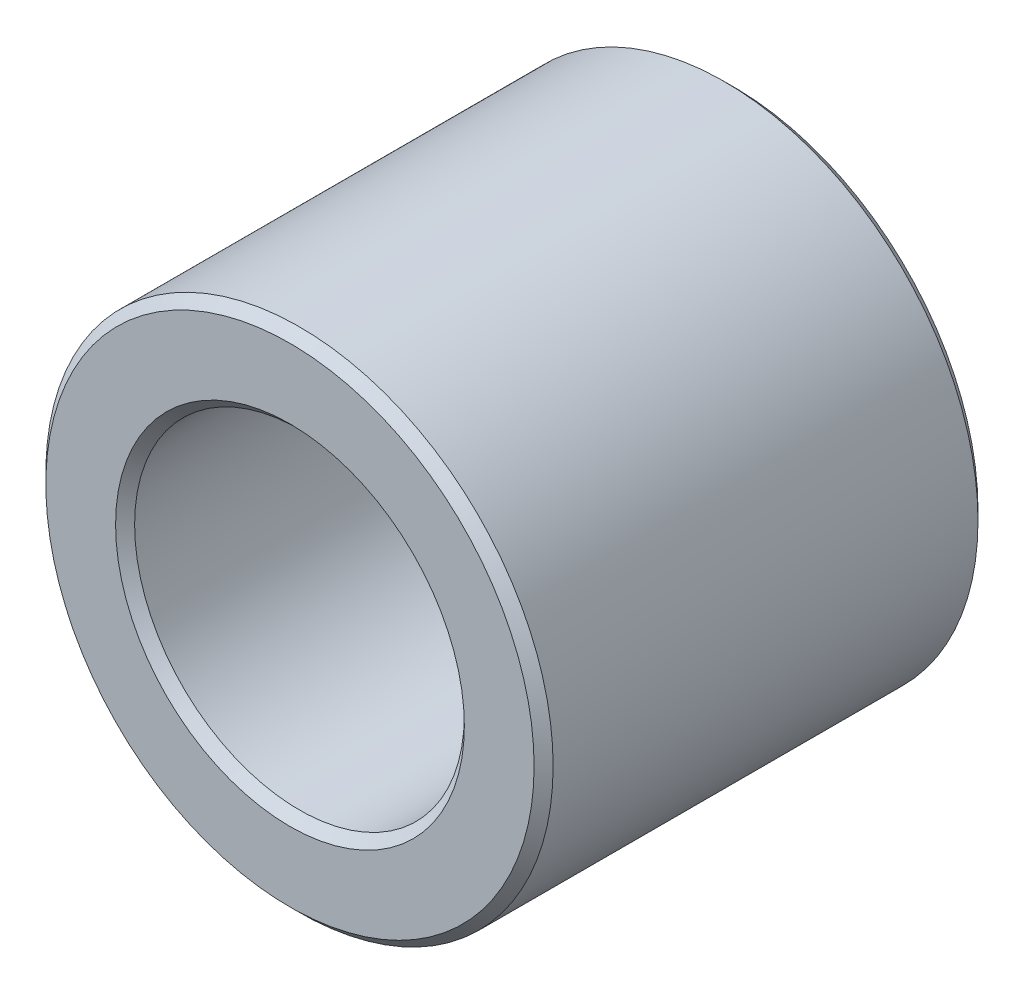
ISO-10303-21;
HEADER;
FILE_DESCRIPTION(('STEP AP214'),'2;1');
FILE_NAME('part.step','',(''),(''),'','','');
FILE_SCHEMA(('AUTOMOTIVE_DESIGN { 1 0 10303 214 1 1 1 1 }'));
ENDSEC;
DATA;
#1=APPLICATION_CONTEXT('core data for automotive mechanical design processes');
#2=APPLICATION_PROTOCOL_DEFINITION('international standard','automotive_design',2000,#1);
#3=PRODUCT_CONTEXT('',#1,'mechanical');
#4=PRODUCT('Part','Part','',(#3));
#5=PRODUCT_RELATED_PRODUCT_CATEGORY('part','',(#4));
#6=PRODUCT_DEFINITION_FORMATION('','',#4);
#7=PRODUCT_DEFINITION_CONTEXT('part definition',#1,'design');
#8=PRODUCT_DEFINITION('design','',#6,#7);
#9=PRODUCT_DEFINITION_SHAPE('','',#8);
#10=(LENGTH_UNIT() NAMED_UNIT(*) SI_UNIT(.MILLI.,.METRE.));
#11=(NAMED_UNIT(*) PLANE_ANGLE_UNIT() SI_UNIT($,.RADIAN.));
#12=(NAMED_UNIT(*) SI_UNIT($,.STERADIAN.) SOLID_ANGLE_UNIT());
#13=UNCERTAINTY_MEASURE_WITH_UNIT(LENGTH_MEASURE(1.E-05),#10,'distance_accuracy_value','');
#14=(GEOMETRIC_REPRESENTATION_CONTEXT(3) GLOBAL_UNCERTAINTY_ASSIGNED_CONTEXT((#13)) GLOBAL_UNIT_ASSIGNED_CONTEXT((#10,
#11,#12)) REPRESENTATION_CONTEXT('',''));
#15=CARTESIAN_POINT('',(0.,0.,0.));
#16=DIRECTION('',(0.,0.,1.));
#17=DIRECTION('',(1.,0.,0.));
#18=AXIS2_PLACEMENT_3D('',#15,#16,#17);
#19=CARTESIAN_POINT('',(0.,0.,0.15));
#20=DIRECTION('',(0.,0.,1.));
#21=DIRECTION('',(1.,0.,0.));
#22=AXIS2_PLACEMENT_3D('',#19,#20,#21);
#23=CONICAL_SURFACE('',#22,4.,0.7853981625);
#24=CARTESIAN_POINT('',(0.,0.,0.15));
#25=DIRECTION('',(0.,0.,1.));
#26=DIRECTION('',(1.,0.,0.));
#27=AXIS2_PLACEMENT_3D('',#24,#25,#26);
#28=CIRCLE('',#27,4.);
#29=CARTESIAN_POINT('',(4.,0.,0.15));
#30=VERTEX_POINT('',#29);
#31=EDGE_CURVE('E20',#30,#30,#28,.T.);
#32=ORIENTED_EDGE('',*,*,#31,.F.);
#33=EDGE_LOOP('',(#32));
#34=FACE_BOUND('',#33,.T.);
#35=CARTESIAN_POINT('',(0.,0.,0.));
#36=DIRECTION('',(0.,0.,-1.));
#37=DIRECTION('',(1.,0.,0.));
#38=AXIS2_PLACEMENT_3D('',#35,#36,#37);
#39=CIRCLE('',#38,3.85);
#40=CARTESIAN_POINT('',(3.85,0.,0.));
#41=VERTEX_POINT('',#40);
#42=EDGE_CURVE('E11',#41,#41,#39,.T.);
#43=ORIENTED_EDGE('',*,*,#42,.F.);
#44=EDGE_LOOP('',(#43));
#45=FACE_BOUND('',#44,.T.);
#46=ADVANCED_FACE('F16',(#34,#45),#23,.T.);
#47=CARTESIAN_POINT('',(0.,0.,0.));
#48=DIRECTION('',(0.,0.,-1.));
#49=DIRECTION('',(-1.,0.,0.));
#50=AXIS2_PLACEMENT_3D('',#47,#48,#49);
#51=CONICAL_SURFACE('',#50,2.75,0.7853981625);
#52=CARTESIAN_POINT('',(0.,0.,0.));
#53=DIRECTION('',(0.,0.,1.));
#54=DIRECTION('',(1.,0.,0.));
#55=AXIS2_PLACEMENT_3D('',#52,#53,#54);
#56=CIRCLE('',#55,2.75);
#57=CARTESIAN_POINT('',(2.75,0.,0.));
#58=VERTEX_POINT('',#57);
#59=EDGE_CURVE('E27',#58,#58,#56,.T.);
#60=ORIENTED_EDGE('',*,*,#59,.F.);
#61=EDGE_LOOP('',(#60));
#62=FACE_BOUND('',#61,.T.);
#63=CARTESIAN_POINT('',(0.,0.,0.15));
#64=DIRECTION('',(0.,0.,-1.));
#65=DIRECTION('',(1.,0.,0.));
#66=AXIS2_PLACEMENT_3D('',#63,#64,#65);
#67=CIRCLE('',#66,2.6);
#68=CARTESIAN_POINT('',(2.6,0.,0.15));
#69=VERTEX_POINT('',#68);
#70=EDGE_CURVE('E77',#69,#69,#67,.T.);
#71=ORIENTED_EDGE('',*,*,#70,.F.);
#72=EDGE_LOOP('',(#71));
#73=FACE_BOUND('',#72,.T.);
#74=ADVANCED_FACE('F99',(#62,#73),#51,.F.);
#75=CARTESIAN_POINT('',(0.,0.,7.));
#76=DIRECTION('',(0.,0.,-1.));
#77=DIRECTION('',(-1.,0.,0.));
#78=AXIS2_PLACEMENT_3D('',#75,#76,#77);
#79=CONICAL_SURFACE('',#78,3.85,0.7853981625);
#80=CARTESIAN_POINT('',(0.,0.,7.));
#81=DIRECTION('',(0.,0.,1.));
#82=DIRECTION('',(1.,0.,0.));
#83=AXIS2_PLACEMENT_3D('',#80,#81,#82);
#84=CIRCLE('',#83,3.85);
#85=CARTESIAN_POINT('',(3.85,0.,7.));
#86=VERTEX_POINT('',#85);
#87=EDGE_CURVE('E83',#86,#86,#84,.T.);
#88=ORIENTED_EDGE('',*,*,#87,.F.);
#89=EDGE_LOOP('',(#88));
#90=FACE_BOUND('',#89,.T.);
#91=CARTESIAN_POINT('',(0.,0.,6.85));
#92=DIRECTION('',(0.,0.,-1.));
#93=DIRECTION('',(1.,0.,0.));
#94=AXIS2_PLACEMENT_3D('',#91,#92,#93);
#95=CIRCLE('',#94,4.);
#96=CARTESIAN_POINT('',(4.,0.,6.85));
#97=VERTEX_POINT('',#96);
#98=EDGE_CURVE('E71',#97,#97,#95,.T.);
#99=ORIENTED_EDGE('',*,*,#98,.F.);
#100=EDGE_LOOP('',(#99));
#101=FACE_BOUND('',#100,.T.);
#102=ADVANCED_FACE('F102',(#90,#101),#79,.T.);
#103=CARTESIAN_POINT('',(0.,0.,6.85));
#104=DIRECTION('',(0.,0.,1.));
#105=DIRECTION('',(1.,0.,0.));
#106=AXIS2_PLACEMENT_3D('',#103,#104,#105);
#107=CONICAL_SURFACE('',#106,2.6,0.7853981625);
#108=CARTESIAN_POINT('',(0.,0.,6.85));
#109=DIRECTION('',(0.,0.,1.));
#110=DIRECTION('',(1.,0.,0.));
#111=AXIS2_PLACEMENT_3D('',#108,#109,#110);
#112=CIRCLE('',#111,2.6);
#113=CARTESIAN_POINT('',(2.6,0.,6.85));
#114=VERTEX_POINT('',#113);
#115=EDGE_CURVE('E59',#114,#114,#112,.T.);
#116=ORIENTED_EDGE('',*,*,#115,.F.);
#117=EDGE_LOOP('',(#116));
#118=FACE_BOUND('',#117,.T.);
#119=CARTESIAN_POINT('',(0.,0.,7.));
#120=DIRECTION('',(0.,0.,-1.));
#121=DIRECTION('',(1.,0.,0.));
#122=AXIS2_PLACEMENT_3D('',#119,#120,#121);
#123=CIRCLE('',#122,2.75);
#124=CARTESIAN_POINT('',(2.75,0.,7.));
#125=VERTEX_POINT('',#124);
#126=EDGE_CURVE('E86',#125,#125,#123,.T.);
#127=ORIENTED_EDGE('',*,*,#126,.F.);
#128=EDGE_LOOP('',(#127));
#129=FACE_BOUND('',#128,.T.);
#130=ADVANCED_FACE('F122',(#118,#129),#107,.F.);
#131=CARTESIAN_POINT('',(0.,0.,0.));
#132=DIRECTION('',(0.,0.,1.));
#133=DIRECTION('',(1.,0.,0.));
#134=AXIS2_PLACEMENT_3D('',#131,#132,#133);
#135=PLANE('',#134);
#136=ORIENTED_EDGE('',*,*,#42,.T.);
#137=EDGE_LOOP('',(#136));
#138=FACE_BOUND('',#137,.T.);
#139=ORIENTED_EDGE('',*,*,#59,.T.);
#140=EDGE_LOOP('',(#139));
#141=FACE_BOUND('',#140,.T.);
#142=ADVANCED_FACE('F97',(#138,#141),#135,.F.);
#143=CARTESIAN_POINT('',(0.,0.,7.));
#144=DIRECTION('',(0.,0.,1.));
#145=DIRECTION('',(1.,0.,0.));
#146=AXIS2_PLACEMENT_3D('',#143,#144,#145);
#147=PLANE('',#146);
#148=ORIENTED_EDGE('',*,*,#87,.T.);
#149=EDGE_LOOP('',(#148));
#150=FACE_BOUND('',#149,.T.);
#151=ORIENTED_EDGE('',*,*,#126,.T.);
#152=EDGE_LOOP('',(#151));
#153=FACE_BOUND('',#152,.T.);
#154=ADVANCED_FACE('F107',(#150,#153),#147,.T.);
#155=CARTESIAN_POINT('',(0.,0.,7.));
#156=DIRECTION('',(0.,0.,-1.));
#157=DIRECTION('',(-1.,0.,0.));
#158=AXIS2_PLACEMENT_3D('',#155,#156,#157);
#159=CYLINDRICAL_SURFACE('',#158,2.6);
#160=ORIENTED_EDGE('',*,*,#70,.T.);
#161=EDGE_LOOP('',(#160));
#162=FACE_BOUND('',#161,.T.);
#163=ORIENTED_EDGE('',*,*,#115,.T.);
#164=EDGE_LOOP('',(#163));
#165=FACE_BOUND('',#164,.T.);
#166=ADVANCED_FACE('F18',(#162,#165),#159,.F.);
#167=CARTESIAN_POINT('',(0.,0.,7.));
#168=DIRECTION('',(0.,0.,-1.));
#169=DIRECTION('',(-1.,0.,0.));
#170=AXIS2_PLACEMENT_3D('',#167,#168,#169);
#171=CYLINDRICAL_SURFACE('',#170,4.);
#172=ORIENTED_EDGE('',*,*,#31,.T.);
#173=EDGE_LOOP('',(#172));
#174=FACE_BOUND('',#173,.T.);
#175=ORIENTED_EDGE('',*,*,#98,.T.);
#176=EDGE_LOOP('',(#175));
#177=FACE_BOUND('',#176,.T.);
#178=ADVANCED_FACE('F67',(#174,#177),#171,.T.);
#179=CLOSED_SHELL('',(#46,#74,#102,#130,#142,#154,#166,#178));
#180=MANIFOLD_SOLID_BREP('B1',#179);
#181=ADVANCED_BREP_SHAPE_REPRESENTATION('',(#18,#180),#14);
#182=SHAPE_DEFINITION_REPRESENTATION(#9,#181);
ENDSEC;
END-ISO-10303-21;
